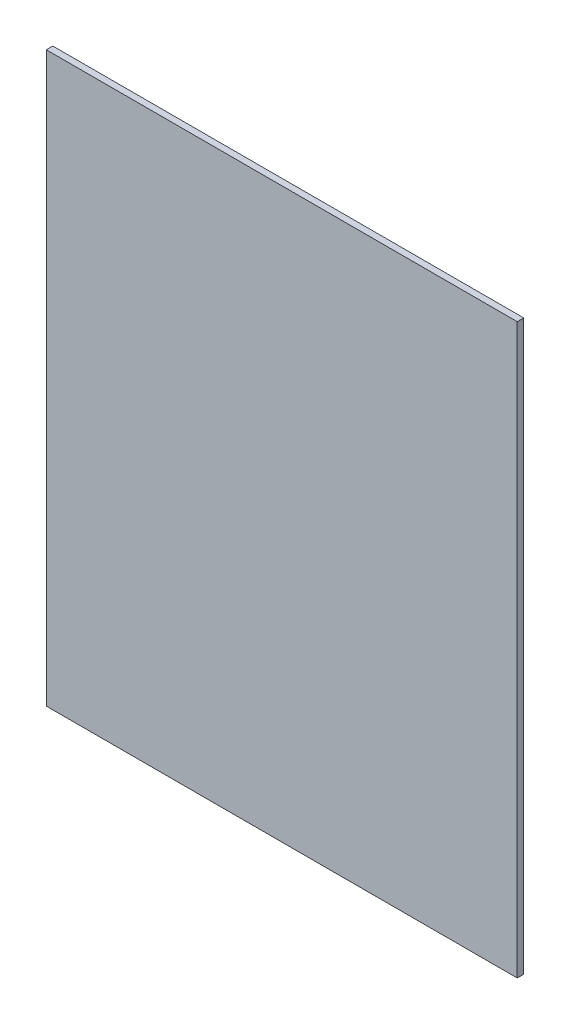
ISO-10303-21;
HEADER;
FILE_DESCRIPTION(('STEP AP214'),'2;1');
FILE_NAME('part.step','',(''),(''),'','','');
FILE_SCHEMA(('AUTOMOTIVE_DESIGN { 1 0 10303 214 1 1 1 1 }'));
ENDSEC;
DATA;
#1=APPLICATION_CONTEXT('core data for automotive mechanical design processes');
#2=APPLICATION_PROTOCOL_DEFINITION('international standard','automotive_design',2000,#1);
#3=PRODUCT_CONTEXT('',#1,'mechanical');
#4=PRODUCT('Part','Part','',(#3));
#5=PRODUCT_RELATED_PRODUCT_CATEGORY('part','',(#4));
#6=PRODUCT_DEFINITION_FORMATION('','',#4);
#7=PRODUCT_DEFINITION_CONTEXT('part definition',#1,'design');
#8=PRODUCT_DEFINITION('design','',#6,#7);
#9=PRODUCT_DEFINITION_SHAPE('','',#8);
#10=(LENGTH_UNIT() NAMED_UNIT(*) SI_UNIT(.MILLI.,.METRE.));
#11=(NAMED_UNIT(*) PLANE_ANGLE_UNIT() SI_UNIT($,.RADIAN.));
#12=(NAMED_UNIT(*) SI_UNIT($,.STERADIAN.) SOLID_ANGLE_UNIT());
#13=UNCERTAINTY_MEASURE_WITH_UNIT(LENGTH_MEASURE(1.E-05),#10,'distance_accuracy_value','');
#14=(GEOMETRIC_REPRESENTATION_CONTEXT(3) GLOBAL_UNCERTAINTY_ASSIGNED_CONTEXT((#13)) GLOBAL_UNIT_ASSIGNED_CONTEXT((#10,
#11,#12)) REPRESENTATION_CONTEXT('',''));
#15=CARTESIAN_POINT('',(0.,0.,0.));
#16=DIRECTION('',(0.,0.,1.));
#17=DIRECTION('',(1.,0.,0.));
#18=AXIS2_PLACEMENT_3D('',#15,#16,#17);
#19=CARTESIAN_POINT('',(7.25,8.75,0.2));
#20=DIRECTION('',(-1.,0.,0.));
#21=DIRECTION('',(0.,-1.,0.));
#22=AXIS2_PLACEMENT_3D('',#19,#20,#21);
#23=PLANE('',#22);
#24=DIRECTION('',(0.,1.,0.));
#25=VECTOR('',#24,1.);
#26=CARTESIAN_POINT('',(7.25,8.75,0.));
#27=LINE('',#26,#25);
#28=CARTESIAN_POINT('',(7.25,-8.75,0.));
#29=VERTEX_POINT('',#28);
#30=CARTESIAN_POINT('',(7.25,8.75,0.));
#31=VERTEX_POINT('',#30);
#32=EDGE_CURVE('E99',#29,#31,#27,.T.);
#33=ORIENTED_EDGE('',*,*,#32,.T.);
#34=DIRECTION('',(0.,0.,-1.));
#35=VECTOR('',#34,1.);
#36=CARTESIAN_POINT('',(7.25,8.75,0.2));
#37=LINE('',#36,#35);
#38=CARTESIAN_POINT('',(7.25,8.75,0.2));
#39=VERTEX_POINT('',#38);
#40=EDGE_CURVE('E11',#39,#31,#37,.T.);
#41=ORIENTED_EDGE('',*,*,#40,.F.);
#42=DIRECTION('',(0.,1.,0.));
#43=VECTOR('',#42,1.);
#44=CARTESIAN_POINT('',(7.25,8.75,0.2));
#45=LINE('',#44,#43);
#46=CARTESIAN_POINT('',(7.25,-8.75,0.2));
#47=VERTEX_POINT('',#46);
#48=EDGE_CURVE('E87',#47,#39,#45,.T.);
#49=ORIENTED_EDGE('',*,*,#48,.F.);
#50=DIRECTION('',(0.,0.,-1.));
#51=VECTOR('',#50,1.);
#52=CARTESIAN_POINT('',(7.25,-8.75,0.2));
#53=LINE('',#52,#51);
#54=EDGE_CURVE('E95',#47,#29,#53,.T.);
#55=ORIENTED_EDGE('',*,*,#54,.T.);
#56=EDGE_LOOP('',(#33,#41,#49,#55));
#57=FACE_BOUND('',#56,.T.);
#58=ADVANCED_FACE('F36',(#57),#23,.F.);
#59=CARTESIAN_POINT('',(-7.25,8.75,0.2));
#60=DIRECTION('',(0.,-1.,0.));
#61=DIRECTION('',(0.,0.,-1.));
#62=AXIS2_PLACEMENT_3D('',#59,#60,#61);
#63=PLANE('',#62);
#64=DIRECTION('',(-1.,0.,0.));
#65=VECTOR('',#64,1.);
#66=CARTESIAN_POINT('',(-7.25,8.75,0.));
#67=LINE('',#66,#65);
#68=CARTESIAN_POINT('',(-7.25,8.75,0.));
#69=VERTEX_POINT('',#68);
#70=EDGE_CURVE('E91',#31,#69,#67,.T.);
#71=ORIENTED_EDGE('',*,*,#70,.T.);
#72=DIRECTION('',(0.,0.,-1.));
#73=VECTOR('',#72,1.);
#74=CARTESIAN_POINT('',(-7.25,8.75,0.2));
#75=LINE('',#74,#73);
#76=CARTESIAN_POINT('',(-7.25,8.75,0.2));
#77=VERTEX_POINT('',#76);
#78=EDGE_CURVE('E44',#77,#69,#75,.T.);
#79=ORIENTED_EDGE('',*,*,#78,.F.);
#80=DIRECTION('',(-1.,0.,0.));
#81=VECTOR('',#80,1.);
#82=CARTESIAN_POINT('',(-7.25,8.75,0.2));
#83=LINE('',#82,#81);
#84=EDGE_CURVE('E82',#39,#77,#83,.T.);
#85=ORIENTED_EDGE('',*,*,#84,.F.);
#86=ORIENTED_EDGE('',*,*,#40,.T.);
#87=EDGE_LOOP('',(#71,#79,#85,#86));
#88=FACE_BOUND('',#87,.T.);
#89=ADVANCED_FACE('F90',(#88),#63,.F.);
#90=CARTESIAN_POINT('',(-7.25,8.75,0.2));
#91=DIRECTION('',(1.,0.,0.));
#92=DIRECTION('',(0.,1.,0.));
#93=AXIS2_PLACEMENT_3D('',#90,#91,#92);
#94=PLANE('',#93);
#95=DIRECTION('',(0.,-1.,0.));
#96=VECTOR('',#95,1.);
#97=CARTESIAN_POINT('',(-7.25,8.75,0.));
#98=LINE('',#97,#96);
#99=CARTESIAN_POINT('',(-7.25,-8.75,0.));
#100=VERTEX_POINT('',#99);
#101=EDGE_CURVE('E69',#69,#100,#98,.T.);
#102=ORIENTED_EDGE('',*,*,#101,.T.);
#103=DIRECTION('',(0.,0.,-1.));
#104=VECTOR('',#103,1.);
#105=CARTESIAN_POINT('',(-7.25,-8.75,0.2));
#106=LINE('',#105,#104);
#107=CARTESIAN_POINT('',(-7.25,-8.75,0.2));
#108=VERTEX_POINT('',#107);
#109=EDGE_CURVE('E92',#108,#100,#106,.T.);
#110=ORIENTED_EDGE('',*,*,#109,.F.);
#111=DIRECTION('',(0.,-1.,0.));
#112=VECTOR('',#111,1.);
#113=CARTESIAN_POINT('',(-7.25,8.75,0.2));
#114=LINE('',#113,#112);
#115=EDGE_CURVE('E85',#77,#108,#114,.T.);
#116=ORIENTED_EDGE('',*,*,#115,.F.);
#117=ORIENTED_EDGE('',*,*,#78,.T.);
#118=EDGE_LOOP('',(#102,#110,#116,#117));
#119=FACE_BOUND('',#118,.T.);
#120=ADVANCED_FACE('F93',(#119),#94,.F.);
#121=CARTESIAN_POINT('',(-7.25,-8.75,0.2));
#122=DIRECTION('',(0.,1.,0.));
#123=DIRECTION('',(0.,0.,1.));
#124=AXIS2_PLACEMENT_3D('',#121,#122,#123);
#125=PLANE('',#124);
#126=DIRECTION('',(1.,0.,0.));
#127=VECTOR('',#126,1.);
#128=CARTESIAN_POINT('',(-7.25,-8.75,0.));
#129=LINE('',#128,#127);
#130=EDGE_CURVE('E75',#100,#29,#129,.T.);
#131=ORIENTED_EDGE('',*,*,#130,.T.);
#132=ORIENTED_EDGE('',*,*,#54,.F.);
#133=DIRECTION('',(1.,0.,0.));
#134=VECTOR('',#133,1.);
#135=CARTESIAN_POINT('',(-7.25,-8.75,0.2));
#136=LINE('',#135,#134);
#137=EDGE_CURVE('E52',#108,#47,#136,.T.);
#138=ORIENTED_EDGE('',*,*,#137,.F.);
#139=ORIENTED_EDGE('',*,*,#109,.T.);
#140=EDGE_LOOP('',(#131,#132,#138,#139));
#141=FACE_BOUND('',#140,.T.);
#142=ADVANCED_FACE('F106',(#141),#125,.F.);
#143=CARTESIAN_POINT('',(0.,0.,0.2));
#144=DIRECTION('',(0.,0.,1.));
#145=DIRECTION('',(1.,0.,0.));
#146=AXIS2_PLACEMENT_3D('',#143,#144,#145);
#147=PLANE('',#146);
#148=ORIENTED_EDGE('',*,*,#48,.T.);
#149=ORIENTED_EDGE('',*,*,#84,.T.);
#150=ORIENTED_EDGE('',*,*,#115,.T.);
#151=ORIENTED_EDGE('',*,*,#137,.T.);
#152=EDGE_LOOP('',(#148,#149,#150,#151));
#153=FACE_BOUND('',#152,.T.);
#154=ADVANCED_FACE('F83',(#153),#147,.T.);
#155=CARTESIAN_POINT('',(0.,0.,0.));
#156=DIRECTION('',(0.,0.,1.));
#157=DIRECTION('',(1.,0.,0.));
#158=AXIS2_PLACEMENT_3D('',#155,#156,#157);
#159=PLANE('',#158);
#160=ORIENTED_EDGE('',*,*,#32,.F.);
#161=ORIENTED_EDGE('',*,*,#130,.F.);
#162=ORIENTED_EDGE('',*,*,#101,.F.);
#163=ORIENTED_EDGE('',*,*,#70,.F.);
#164=EDGE_LOOP('',(#160,#161,#162,#163));
#165=FACE_BOUND('',#164,.T.);
#166=ADVANCED_FACE('F109',(#165),#159,.F.);
#167=CLOSED_SHELL('',(#58,#89,#120,#142,#154,#166));
#168=MANIFOLD_SOLID_BREP('B2',#167);
#169=ADVANCED_BREP_SHAPE_REPRESENTATION('',(#18,#168),#14);
#170=SHAPE_DEFINITION_REPRESENTATION(#9,#169);
ENDSEC;
END-ISO-10303-21;
